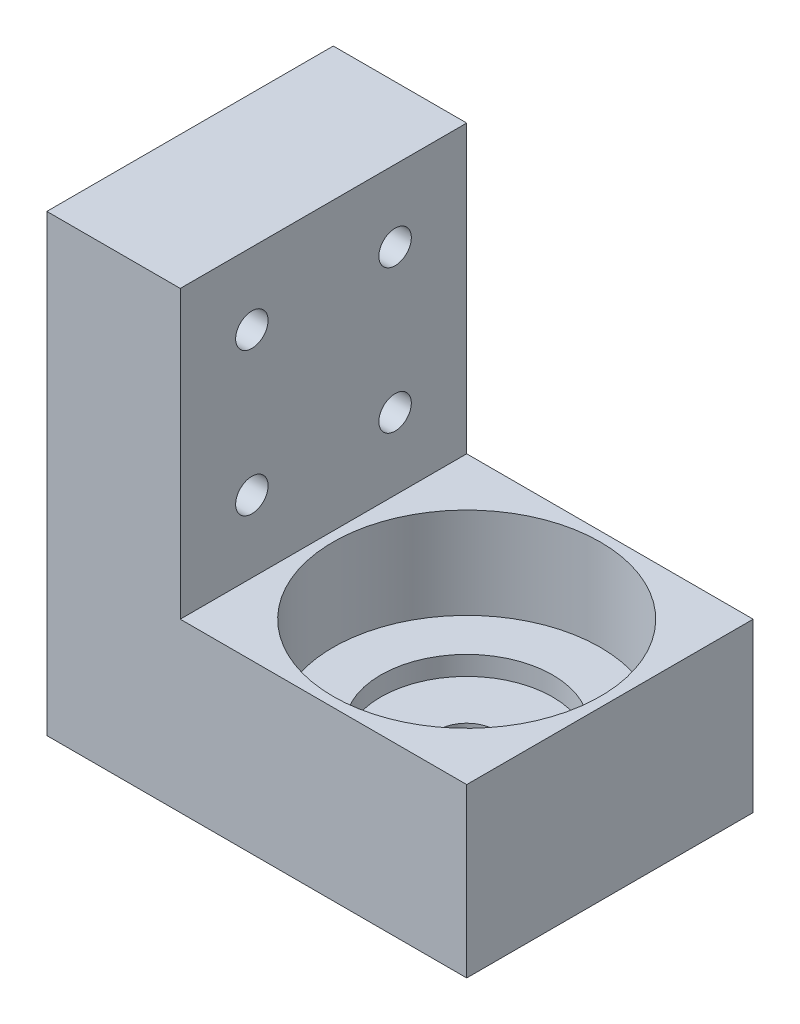
ISO-10303-21;
HEADER;
FILE_DESCRIPTION(('STEP AP214'),'2;1');
FILE_NAME('part.step','',(''),(''),'','','');
FILE_SCHEMA(('AUTOMOTIVE_DESIGN { 1 0 10303 214 1 1 1 1 }'));
ENDSEC;
DATA;
#1=APPLICATION_CONTEXT('core data for automotive mechanical design processes');
#2=APPLICATION_PROTOCOL_DEFINITION('international standard','automotive_design',2000,#1);
#3=PRODUCT_CONTEXT('',#1,'mechanical');
#4=PRODUCT('Part','Part','',(#3));
#5=PRODUCT_RELATED_PRODUCT_CATEGORY('part','',(#4));
#6=PRODUCT_DEFINITION_FORMATION('','',#4);
#7=PRODUCT_DEFINITION_CONTEXT('part definition',#1,'design');
#8=PRODUCT_DEFINITION('design','',#6,#7);
#9=PRODUCT_DEFINITION_SHAPE('','',#8);
#10=(LENGTH_UNIT() NAMED_UNIT(*) SI_UNIT(.MILLI.,.METRE.));
#11=(NAMED_UNIT(*) PLANE_ANGLE_UNIT() SI_UNIT($,.RADIAN.));
#12=(NAMED_UNIT(*) SI_UNIT($,.STERADIAN.) SOLID_ANGLE_UNIT());
#13=UNCERTAINTY_MEASURE_WITH_UNIT(LENGTH_MEASURE(1.E-05),#10,'distance_accuracy_value','');
#14=(GEOMETRIC_REPRESENTATION_CONTEXT(3) GLOBAL_UNCERTAINTY_ASSIGNED_CONTEXT((#13)) GLOBAL_UNIT_ASSIGNED_CONTEXT((#10,
#11,#12)) REPRESENTATION_CONTEXT('',''));
#15=CARTESIAN_POINT('',(0.,0.,0.));
#16=DIRECTION('',(0.,0.,1.));
#17=DIRECTION('',(1.,0.,0.));
#18=AXIS2_PLACEMENT_3D('',#15,#16,#17);
#19=CARTESIAN_POINT('',(0.,17.5441064292772,0.));
#20=DIRECTION('',(0.,0.,-1.));
#21=DIRECTION('',(-1.,0.,0.));
#22=AXIS2_PLACEMENT_3D('',#19,#20,#21);
#23=PLANE('',#22);
#24=DIRECTION('',(1.,0.,0.));
#25=VECTOR('',#24,1.);
#26=CARTESIAN_POINT('',(0.,0.,0.));
#27=LINE('',#26,#25);
#28=CARTESIAN_POINT('',(-13.9728460293658,0.,0.));
#29=VERTEX_POINT('',#28);
#30=CARTESIAN_POINT('',(30.,0.,0.));
#31=VERTEX_POINT('',#30);
#32=EDGE_CURVE('E83',#29,#31,#27,.T.);
#33=ORIENTED_EDGE('',*,*,#32,.T.);
#34=DIRECTION('',(0.,-1.,0.));
#35=VECTOR('',#34,1.);
#36=CARTESIAN_POINT('',(30.,17.5441064292772,0.));
#37=LINE('',#36,#35);
#38=CARTESIAN_POINT('',(30.,17.5441064292772,0.));
#39=VERTEX_POINT('',#38);
#40=EDGE_CURVE('E13',#39,#31,#37,.T.);
#41=ORIENTED_EDGE('',*,*,#40,.F.);
#42=DIRECTION('',(1.,0.,0.));
#43=VECTOR('',#42,1.);
#44=CARTESIAN_POINT('',(0.,17.5441064292772,0.));
#45=LINE('',#44,#43);
#46=CARTESIAN_POINT('',(0.,17.5441064292772,0.));
#47=VERTEX_POINT('',#46);
#48=EDGE_CURVE('E113',#47,#39,#45,.T.);
#49=ORIENTED_EDGE('',*,*,#48,.F.);
#50=DIRECTION('',(0.,1.,0.));
#51=VECTOR('',#50,1.);
#52=CARTESIAN_POINT('',(0.,0.,0.));
#53=LINE('',#52,#51);
#54=CARTESIAN_POINT('',(0.,47.5441064292772,0.));
#55=VERTEX_POINT('',#54);
#56=EDGE_CURVE('E102',#47,#55,#53,.T.);
#57=ORIENTED_EDGE('',*,*,#56,.T.);
#58=DIRECTION('',(1.,0.,0.));
#59=VECTOR('',#58,1.);
#60=CARTESIAN_POINT('',(-13.9728460293658,47.5441064292772,0.));
#61=LINE('',#60,#59);
#62=CARTESIAN_POINT('',(-13.9728460293658,47.5441064292772,0.));
#63=VERTEX_POINT('',#62);
#64=EDGE_CURVE('E184',#63,#55,#61,.T.);
#65=ORIENTED_EDGE('',*,*,#64,.F.);
#66=DIRECTION('',(0.,1.,0.));
#67=VECTOR('',#66,1.);
#68=CARTESIAN_POINT('',(-13.9728460293658,0.,0.));
#69=LINE('',#68,#67);
#70=EDGE_CURVE('E158',#29,#63,#69,.T.);
#71=ORIENTED_EDGE('',*,*,#70,.F.);
#72=EDGE_LOOP('',(#33,#41,#49,#57,#65,#71));
#73=FACE_BOUND('',#72,.T.);
#74=ADVANCED_FACE('F54',(#73),#23,.F.);
#75=CARTESIAN_POINT('',(30.,17.5441064292772,0.));
#76=DIRECTION('',(-1.,0.,0.));
#77=DIRECTION('',(0.,0.,1.));
#78=AXIS2_PLACEMENT_3D('',#75,#76,#77);
#79=PLANE('',#78);
#80=DIRECTION('',(0.,0.,-1.));
#81=VECTOR('',#80,1.);
#82=CARTESIAN_POINT('',(30.,0.,0.));
#83=LINE('',#82,#81);
#84=CARTESIAN_POINT('',(30.,0.,-30.));
#85=VERTEX_POINT('',#84);
#86=EDGE_CURVE('E124',#31,#85,#83,.T.);
#87=ORIENTED_EDGE('',*,*,#86,.T.);
#88=DIRECTION('',(0.,-1.,0.));
#89=VECTOR('',#88,1.);
#90=CARTESIAN_POINT('',(30.,17.5441064292772,-30.));
#91=LINE('',#90,#89);
#92=CARTESIAN_POINT('',(30.,17.5441064292772,-30.));
#93=VERTEX_POINT('',#92);
#94=EDGE_CURVE('E63',#93,#85,#91,.T.);
#95=ORIENTED_EDGE('',*,*,#94,.F.);
#96=DIRECTION('',(0.,0.,-1.));
#97=VECTOR('',#96,1.);
#98=CARTESIAN_POINT('',(30.,17.5441064292772,0.));
#99=LINE('',#98,#97);
#100=EDGE_CURVE('E71',#39,#93,#99,.T.);
#101=ORIENTED_EDGE('',*,*,#100,.F.);
#102=ORIENTED_EDGE('',*,*,#40,.T.);
#103=EDGE_LOOP('',(#87,#95,#101,#102));
#104=FACE_BOUND('',#103,.T.);
#105=ADVANCED_FACE('F220',(#104),#79,.F.);
#106=CARTESIAN_POINT('',(0.,17.5441064292772,-30.));
#107=DIRECTION('',(0.,0.,1.));
#108=DIRECTION('',(1.,0.,0.));
#109=AXIS2_PLACEMENT_3D('',#106,#107,#108);
#110=PLANE('',#109);
#111=DIRECTION('',(-1.,0.,0.));
#112=VECTOR('',#111,1.);
#113=CARTESIAN_POINT('',(0.,0.,-30.));
#114=LINE('',#113,#112);
#115=CARTESIAN_POINT('',(-13.9728460293658,0.,-30.));
#116=VERTEX_POINT('',#115);
#117=EDGE_CURVE('E120',#85,#116,#114,.T.);
#118=ORIENTED_EDGE('',*,*,#117,.T.);
#119=DIRECTION('',(0.,-1.,0.));
#120=VECTOR('',#119,1.);
#121=CARTESIAN_POINT('',(-13.9728460293658,0.,-30.));
#122=LINE('',#121,#120);
#123=CARTESIAN_POINT('',(-13.9728460293658,47.5441064292772,-30.));
#124=VERTEX_POINT('',#123);
#125=EDGE_CURVE('E159',#124,#116,#122,.T.);
#126=ORIENTED_EDGE('',*,*,#125,.F.);
#127=DIRECTION('',(1.,0.,0.));
#128=VECTOR('',#127,1.);
#129=CARTESIAN_POINT('',(-13.9728460293658,47.5441064292772,-30.));
#130=LINE('',#129,#128);
#131=CARTESIAN_POINT('',(0.,47.5441064292772,-30.));
#132=VERTEX_POINT('',#131);
#133=EDGE_CURVE('E178',#124,#132,#130,.T.);
#134=ORIENTED_EDGE('',*,*,#133,.T.);
#135=DIRECTION('',(0.,-1.,0.));
#136=VECTOR('',#135,1.);
#137=CARTESIAN_POINT('',(0.,0.,-30.));
#138=LINE('',#137,#136);
#139=CARTESIAN_POINT('',(0.,17.5441064292772,-30.));
#140=VERTEX_POINT('',#139);
#141=EDGE_CURVE('E111',#132,#140,#138,.T.);
#142=ORIENTED_EDGE('',*,*,#141,.T.);
#143=DIRECTION('',(-1.,0.,0.));
#144=VECTOR('',#143,1.);
#145=CARTESIAN_POINT('',(0.,17.5441064292772,-30.));
#146=LINE('',#145,#144);
#147=EDGE_CURVE('E118',#93,#140,#146,.T.);
#148=ORIENTED_EDGE('',*,*,#147,.F.);
#149=ORIENTED_EDGE('',*,*,#94,.T.);
#150=EDGE_LOOP('',(#118,#126,#134,#142,#148,#149));
#151=FACE_BOUND('',#150,.T.);
#152=ADVANCED_FACE('F142',(#151),#110,.F.);
#153=CARTESIAN_POINT('',(0.,17.5441064292772,0.));
#154=DIRECTION('',(0.,-1.,0.));
#155=DIRECTION('',(0.,0.,-1.));
#156=AXIS2_PLACEMENT_3D('',#153,#154,#155);
#157=PLANE('',#156);
#158=CARTESIAN_POINT('',(15.,17.5441064292772,-15.));
#159=DIRECTION('',(0.,1.,0.));
#160=DIRECTION('',(0.,0.,1.));
#161=AXIS2_PLACEMENT_3D('',#158,#159,#160);
#162=CIRCLE('',#161,14.);
#163=CARTESIAN_POINT('',(15.,17.5441064292772,-0.999999999999997));
#164=VERTEX_POINT('',#163);
#165=EDGE_CURVE('E127',#164,#164,#162,.T.);
#166=ORIENTED_EDGE('',*,*,#165,.F.);
#167=EDGE_LOOP('',(#166));
#168=FACE_BOUND('',#167,.T.);
#169=DIRECTION('',(0.,0.,1.));
#170=VECTOR('',#169,1.);
#171=CARTESIAN_POINT('',(0.,17.5441064292772,0.));
#172=LINE('',#171,#170);
#173=EDGE_CURVE('E92',#140,#47,#172,.T.);
#174=ORIENTED_EDGE('',*,*,#173,.T.);
#175=ORIENTED_EDGE('',*,*,#48,.T.);
#176=ORIENTED_EDGE('',*,*,#100,.T.);
#177=ORIENTED_EDGE('',*,*,#147,.T.);
#178=EDGE_LOOP('',(#174,#175,#176,#177));
#179=FACE_BOUND('',#178,.T.);
#180=ADVANCED_FACE('F116',(#168,#179),#157,.F.);
#181=CARTESIAN_POINT('',(0.,0.,0.));
#182=DIRECTION('',(0.,-1.,0.));
#183=DIRECTION('',(0.,0.,-1.));
#184=AXIS2_PLACEMENT_3D('',#181,#182,#183);
#185=PLANE('',#184);
#186=CARTESIAN_POINT('',(15.,0.,-15.));
#187=DIRECTION('',(0.,1.,0.));
#188=DIRECTION('',(0.,0.,1.));
#189=AXIS2_PLACEMENT_3D('',#186,#187,#188);
#190=CIRCLE('',#189,3.);
#191=CARTESIAN_POINT('',(15.,0.,-12.));
#192=VERTEX_POINT('',#191);
#193=EDGE_CURVE('E188',#192,#192,#190,.T.);
#194=ORIENTED_EDGE('',*,*,#193,.T.);
#195=EDGE_LOOP('',(#194));
#196=FACE_BOUND('',#195,.T.);
#197=ORIENTED_EDGE('',*,*,#32,.F.);
#198=DIRECTION('',(0.,0.,1.));
#199=VECTOR('',#198,1.);
#200=CARTESIAN_POINT('',(-13.9728460293658,0.,-30.));
#201=LINE('',#200,#199);
#202=EDGE_CURVE('E151',#116,#29,#201,.T.);
#203=ORIENTED_EDGE('',*,*,#202,.F.);
#204=ORIENTED_EDGE('',*,*,#117,.F.);
#205=ORIENTED_EDGE('',*,*,#86,.F.);
#206=EDGE_LOOP('',(#197,#203,#204,#205));
#207=FACE_BOUND('',#206,.T.);
#208=ADVANCED_FACE('F149',(#196,#207),#185,.T.);
#209=CARTESIAN_POINT('',(15.,7.99010642927719,-15.));
#210=DIRECTION('',(0.,1.,0.));
#211=DIRECTION('',(0.,0.,1.));
#212=AXIS2_PLACEMENT_3D('',#209,#210,#211);
#213=CYLINDRICAL_SURFACE('',#212,14.);
#214=CARTESIAN_POINT('',(15.,7.99010642927719,-15.));
#215=DIRECTION('',(0.,1.,0.));
#216=DIRECTION('',(0.,0.,1.));
#217=AXIS2_PLACEMENT_3D('',#214,#215,#216);
#218=CIRCLE('',#217,14.);
#219=CARTESIAN_POINT('',(15.,7.99010642927719,-0.999999999999997));
#220=VERTEX_POINT('',#219);
#221=EDGE_CURVE('E136',#220,#220,#218,.T.);
#222=ORIENTED_EDGE('',*,*,#221,.F.);
#223=EDGE_LOOP('',(#222));
#224=FACE_BOUND('',#223,.T.);
#225=ORIENTED_EDGE('',*,*,#165,.T.);
#226=EDGE_LOOP('',(#225));
#227=FACE_BOUND('',#226,.T.);
#228=ADVANCED_FACE('F210',(#224,#227),#213,.F.);
#229=CARTESIAN_POINT('',(15.,7.99010642927719,-15.));
#230=DIRECTION('',(0.,1.,0.));
#231=DIRECTION('',(0.,0.,1.));
#232=AXIS2_PLACEMENT_3D('',#229,#230,#231);
#233=PLANE('',#232);
#234=CARTESIAN_POINT('',(15.,7.99010642927719,-15.));
#235=DIRECTION('',(0.,1.,0.));
#236=DIRECTION('',(0.,0.,1.));
#237=AXIS2_PLACEMENT_3D('',#234,#235,#236);
#238=CIRCLE('',#237,9.);
#239=CARTESIAN_POINT('',(15.,7.99010642927719,-6.));
#240=VERTEX_POINT('',#239);
#241=EDGE_CURVE('E192',#240,#240,#238,.T.);
#242=ORIENTED_EDGE('',*,*,#241,.F.);
#243=EDGE_LOOP('',(#242));
#244=FACE_BOUND('',#243,.T.);
#245=ORIENTED_EDGE('',*,*,#221,.T.);
#246=EDGE_LOOP('',(#245));
#247=FACE_BOUND('',#246,.T.);
#248=ADVANCED_FACE('F362',(#244,#247),#233,.T.);
#249=CARTESIAN_POINT('',(15.,5.99010642927719,-15.));
#250=DIRECTION('',(0.,1.,0.));
#251=DIRECTION('',(0.,0.,1.));
#252=AXIS2_PLACEMENT_3D('',#249,#250,#251);
#253=CYLINDRICAL_SURFACE('',#252,9.);
#254=CARTESIAN_POINT('',(15.,5.99010642927719,-15.));
#255=DIRECTION('',(0.,1.,0.));
#256=DIRECTION('',(0.,0.,1.));
#257=AXIS2_PLACEMENT_3D('',#254,#255,#256);
#258=CIRCLE('',#257,9.);
#259=CARTESIAN_POINT('',(15.,5.99010642927719,-6.));
#260=VERTEX_POINT('',#259);
#261=EDGE_CURVE('E196',#260,#260,#258,.T.);
#262=ORIENTED_EDGE('',*,*,#261,.F.);
#263=EDGE_LOOP('',(#262));
#264=FACE_BOUND('',#263,.T.);
#265=ORIENTED_EDGE('',*,*,#241,.T.);
#266=EDGE_LOOP('',(#265));
#267=FACE_BOUND('',#266,.T.);
#268=ADVANCED_FACE('F352',(#264,#267),#253,.F.);
#269=CARTESIAN_POINT('',(15.,5.99010642927719,-15.));
#270=DIRECTION('',(0.,1.,0.));
#271=DIRECTION('',(0.,0.,1.));
#272=AXIS2_PLACEMENT_3D('',#269,#270,#271);
#273=PLANE('',#272);
#274=CARTESIAN_POINT('',(15.,5.99010642927719,-15.));
#275=DIRECTION('',(0.,1.,0.));
#276=DIRECTION('',(0.,0.,1.));
#277=AXIS2_PLACEMENT_3D('',#274,#275,#276);
#278=CIRCLE('',#277,3.);
#279=CARTESIAN_POINT('',(15.,5.99010642927719,-12.));
#280=VERTEX_POINT('',#279);
#281=EDGE_CURVE('E187',#280,#280,#278,.T.);
#282=ORIENTED_EDGE('',*,*,#281,.F.);
#283=EDGE_LOOP('',(#282));
#284=FACE_BOUND('',#283,.T.);
#285=ORIENTED_EDGE('',*,*,#261,.T.);
#286=EDGE_LOOP('',(#285));
#287=FACE_BOUND('',#286,.T.);
#288=ADVANCED_FACE('F343',(#284,#287),#273,.T.);
#289=CARTESIAN_POINT('',(15.,0.,-15.));
#290=DIRECTION('',(0.,1.,0.));
#291=DIRECTION('',(0.,0.,1.));
#292=AXIS2_PLACEMENT_3D('',#289,#290,#291);
#293=CYLINDRICAL_SURFACE('',#292,3.);
#294=ORIENTED_EDGE('',*,*,#193,.F.);
#295=EDGE_LOOP('',(#294));
#296=FACE_BOUND('',#295,.T.);
#297=ORIENTED_EDGE('',*,*,#281,.T.);
#298=EDGE_LOOP('',(#297));
#299=FACE_BOUND('',#298,.T.);
#300=ADVANCED_FACE('F273',(#296,#299),#293,.F.);
#301=CARTESIAN_POINT('',(0.,0.,0.));
#302=DIRECTION('',(1.,0.,0.));
#303=DIRECTION('',(0.,0.,-1.));
#304=AXIS2_PLACEMENT_3D('',#301,#302,#303);
#305=PLANE('',#304);
#306=CARTESIAN_POINT('',(0.,40.054,-7.5));
#307=DIRECTION('',(1.,0.,0.));
#308=DIRECTION('',(0.,0.,-1.));
#309=AXIS2_PLACEMENT_3D('',#306,#307,#308);
#310=CIRCLE('',#309,1.7);
#311=CARTESIAN_POINT('',(0.,40.054,-9.2));
#312=VERTEX_POINT('',#311);
#313=EDGE_CURVE('E425',#312,#312,#310,.T.);
#314=ORIENTED_EDGE('',*,*,#313,.F.);
#315=EDGE_LOOP('',(#314));
#316=FACE_BOUND('',#315,.T.);
#317=CARTESIAN_POINT('',(0.,25.054,-22.5));
#318=DIRECTION('',(1.,0.,0.));
#319=DIRECTION('',(0.,0.,-1.));
#320=AXIS2_PLACEMENT_3D('',#317,#318,#319);
#321=CIRCLE('',#320,1.7);
#322=CARTESIAN_POINT('',(0.,25.054,-24.2));
#323=VERTEX_POINT('',#322);
#324=EDGE_CURVE('E431',#323,#323,#321,.T.);
#325=ORIENTED_EDGE('',*,*,#324,.F.);
#326=EDGE_LOOP('',(#325));
#327=FACE_BOUND('',#326,.T.);
#328=CARTESIAN_POINT('',(0.,40.054,-22.5));
#329=DIRECTION('',(1.,0.,0.));
#330=DIRECTION('',(0.,0.,-1.));
#331=AXIS2_PLACEMENT_3D('',#328,#329,#330);
#332=CIRCLE('',#331,1.7);
#333=CARTESIAN_POINT('',(0.,40.054,-24.2));
#334=VERTEX_POINT('',#333);
#335=EDGE_CURVE('E443',#334,#334,#332,.T.);
#336=ORIENTED_EDGE('',*,*,#335,.F.);
#337=EDGE_LOOP('',(#336));
#338=FACE_BOUND('',#337,.T.);
#339=CARTESIAN_POINT('',(0.,25.054,-7.5));
#340=DIRECTION('',(1.,0.,0.));
#341=DIRECTION('',(0.,0.,-1.));
#342=AXIS2_PLACEMENT_3D('',#339,#340,#341);
#343=CIRCLE('',#342,1.7);
#344=CARTESIAN_POINT('',(0.,25.054,-9.2));
#345=VERTEX_POINT('',#344);
#346=EDGE_CURVE('E171',#345,#345,#343,.T.);
#347=ORIENTED_EDGE('',*,*,#346,.F.);
#348=EDGE_LOOP('',(#347));
#349=FACE_BOUND('',#348,.T.);
#350=ORIENTED_EDGE('',*,*,#173,.F.);
#351=ORIENTED_EDGE('',*,*,#141,.F.);
#352=DIRECTION('',(0.,0.,-1.));
#353=VECTOR('',#352,1.);
#354=CARTESIAN_POINT('',(0.,47.5441064292772,-30.));
#355=LINE('',#354,#353);
#356=EDGE_CURVE('E107',#55,#132,#355,.T.);
#357=ORIENTED_EDGE('',*,*,#356,.F.);
#358=ORIENTED_EDGE('',*,*,#56,.F.);
#359=EDGE_LOOP('',(#350,#351,#357,#358));
#360=FACE_BOUND('',#359,.T.);
#361=ADVANCED_FACE('F104',(#316,#327,#338,#349,#360),#305,.T.);
#362=CARTESIAN_POINT('',(-13.9728460293658,47.5441064292772,-30.));
#363=DIRECTION('',(0.,-1.,0.));
#364=DIRECTION('',(0.,0.,-1.));
#365=AXIS2_PLACEMENT_3D('',#362,#363,#364);
#366=PLANE('',#365);
#367=ORIENTED_EDGE('',*,*,#356,.T.);
#368=ORIENTED_EDGE('',*,*,#133,.F.);
#369=DIRECTION('',(0.,0.,-1.));
#370=VECTOR('',#369,1.);
#371=CARTESIAN_POINT('',(-13.9728460293658,47.5441064292772,-30.));
#372=LINE('',#371,#370);
#373=EDGE_CURVE('E163',#63,#124,#372,.T.);
#374=ORIENTED_EDGE('',*,*,#373,.F.);
#375=ORIENTED_EDGE('',*,*,#64,.T.);
#376=EDGE_LOOP('',(#367,#368,#374,#375));
#377=FACE_BOUND('',#376,.T.);
#378=ADVANCED_FACE('F257',(#377),#366,.F.);
#379=CARTESIAN_POINT('',(-13.9728460293658,0.,0.));
#380=DIRECTION('',(1.,0.,0.));
#381=DIRECTION('',(0.,0.,-1.));
#382=AXIS2_PLACEMENT_3D('',#379,#380,#381);
#383=PLANE('',#382);
#384=CARTESIAN_POINT('',(-13.9728460293658,40.054,-7.5));
#385=DIRECTION('',(1.,0.,0.));
#386=DIRECTION('',(0.,0.,-1.));
#387=AXIS2_PLACEMENT_3D('',#384,#385,#386);
#388=CIRCLE('',#387,1.7);
#389=CARTESIAN_POINT('',(-13.9728460293658,40.054,-9.2));
#390=VERTEX_POINT('',#389);
#391=EDGE_CURVE('E422',#390,#390,#388,.T.);
#392=ORIENTED_EDGE('',*,*,#391,.T.);
#393=EDGE_LOOP('',(#392));
#394=FACE_BOUND('',#393,.T.);
#395=CARTESIAN_POINT('',(-13.9728460293658,25.054,-22.5));
#396=DIRECTION('',(1.,0.,0.));
#397=DIRECTION('',(0.,0.,-1.));
#398=AXIS2_PLACEMENT_3D('',#395,#396,#397);
#399=CIRCLE('',#398,1.7);
#400=CARTESIAN_POINT('',(-13.9728460293658,25.054,-24.2));
#401=VERTEX_POINT('',#400);
#402=EDGE_CURVE('E440',#401,#401,#399,.T.);
#403=ORIENTED_EDGE('',*,*,#402,.T.);
#404=EDGE_LOOP('',(#403));
#405=FACE_BOUND('',#404,.T.);
#406=CARTESIAN_POINT('',(-13.9728460293658,40.054,-22.5));
#407=DIRECTION('',(1.,0.,0.));
#408=DIRECTION('',(0.,0.,-1.));
#409=AXIS2_PLACEMENT_3D('',#406,#407,#408);
#410=CIRCLE('',#409,1.7);
#411=CARTESIAN_POINT('',(-13.9728460293658,40.054,-24.2));
#412=VERTEX_POINT('',#411);
#413=EDGE_CURVE('E434',#412,#412,#410,.T.);
#414=ORIENTED_EDGE('',*,*,#413,.T.);
#415=EDGE_LOOP('',(#414));
#416=FACE_BOUND('',#415,.T.);
#417=CARTESIAN_POINT('',(-13.9728460293658,25.054,-7.5));
#418=DIRECTION('',(1.,0.,0.));
#419=DIRECTION('',(0.,0.,-1.));
#420=AXIS2_PLACEMENT_3D('',#417,#418,#419);
#421=CIRCLE('',#420,1.7);
#422=CARTESIAN_POINT('',(-13.9728460293658,25.054,-9.2));
#423=VERTEX_POINT('',#422);
#424=EDGE_CURVE('E180',#423,#423,#421,.T.);
#425=ORIENTED_EDGE('',*,*,#424,.T.);
#426=EDGE_LOOP('',(#425));
#427=FACE_BOUND('',#426,.T.);
#428=ORIENTED_EDGE('',*,*,#125,.T.);
#429=ORIENTED_EDGE('',*,*,#202,.T.);
#430=ORIENTED_EDGE('',*,*,#70,.T.);
#431=ORIENTED_EDGE('',*,*,#373,.T.);
#432=EDGE_LOOP('',(#428,#429,#430,#431));
#433=FACE_BOUND('',#432,.T.);
#434=ADVANCED_FACE('F161',(#394,#405,#416,#427,#433),#383,.F.);
#435=CARTESIAN_POINT('',(-13.9728460293658,25.054,-7.5));
#436=DIRECTION('',(1.,0.,0.));
#437=DIRECTION('',(0.,0.,-1.));
#438=AXIS2_PLACEMENT_3D('',#435,#436,#437);
#439=CYLINDRICAL_SURFACE('',#438,1.7);
#440=ORIENTED_EDGE('',*,*,#424,.F.);
#441=EDGE_LOOP('',(#440));
#442=FACE_BOUND('',#441,.T.);
#443=ORIENTED_EDGE('',*,*,#346,.T.);
#444=EDGE_LOOP('',(#443));
#445=FACE_BOUND('',#444,.T.);
#446=ADVANCED_FACE('F283',(#442,#445),#439,.F.);
#447=CARTESIAN_POINT('',(-13.9728460293658,40.054,-22.5));
#448=DIRECTION('',(1.,0.,0.));
#449=DIRECTION('',(0.,0.,-1.));
#450=AXIS2_PLACEMENT_3D('',#447,#448,#449);
#451=CYLINDRICAL_SURFACE('',#450,1.7);
#452=ORIENTED_EDGE('',*,*,#413,.F.);
#453=EDGE_LOOP('',(#452));
#454=FACE_BOUND('',#453,.T.);
#455=ORIENTED_EDGE('',*,*,#335,.T.);
#456=EDGE_LOOP('',(#455));
#457=FACE_BOUND('',#456,.T.);
#458=ADVANCED_FACE('F294',(#454,#457),#451,.F.);
#459=CARTESIAN_POINT('',(-13.9728460293658,25.054,-22.5));
#460=DIRECTION('',(1.,0.,0.));
#461=DIRECTION('',(0.,0.,-1.));
#462=AXIS2_PLACEMENT_3D('',#459,#460,#461);
#463=CYLINDRICAL_SURFACE('',#462,1.7);
#464=ORIENTED_EDGE('',*,*,#402,.F.);
#465=EDGE_LOOP('',(#464));
#466=FACE_BOUND('',#465,.T.);
#467=ORIENTED_EDGE('',*,*,#324,.T.);
#468=EDGE_LOOP('',(#467));
#469=FACE_BOUND('',#468,.T.);
#470=ADVANCED_FACE('F305',(#466,#469),#463,.F.);
#471=CARTESIAN_POINT('',(-13.9728460293658,40.054,-7.5));
#472=DIRECTION('',(1.,0.,0.));
#473=DIRECTION('',(0.,0.,-1.));
#474=AXIS2_PLACEMENT_3D('',#471,#472,#473);
#475=CYLINDRICAL_SURFACE('',#474,1.7);
#476=ORIENTED_EDGE('',*,*,#391,.F.);
#477=EDGE_LOOP('',(#476));
#478=FACE_BOUND('',#477,.T.);
#479=ORIENTED_EDGE('',*,*,#313,.T.);
#480=EDGE_LOOP('',(#479));
#481=FACE_BOUND('',#480,.T.);
#482=ADVANCED_FACE('F316',(#478,#481),#475,.F.);
#483=CLOSED_SHELL('',(#74,#105,#152,#180,#208,#228,#248,#268,#288,#300,#361,#378,#434,#446,#458,
#470,#482));
#484=MANIFOLD_SOLID_BREP('B2',#483);
#485=ADVANCED_BREP_SHAPE_REPRESENTATION('',(#18,#484),#14);
#486=SHAPE_DEFINITION_REPRESENTATION(#9,#485);
ENDSEC;
END-ISO-10303-21;
